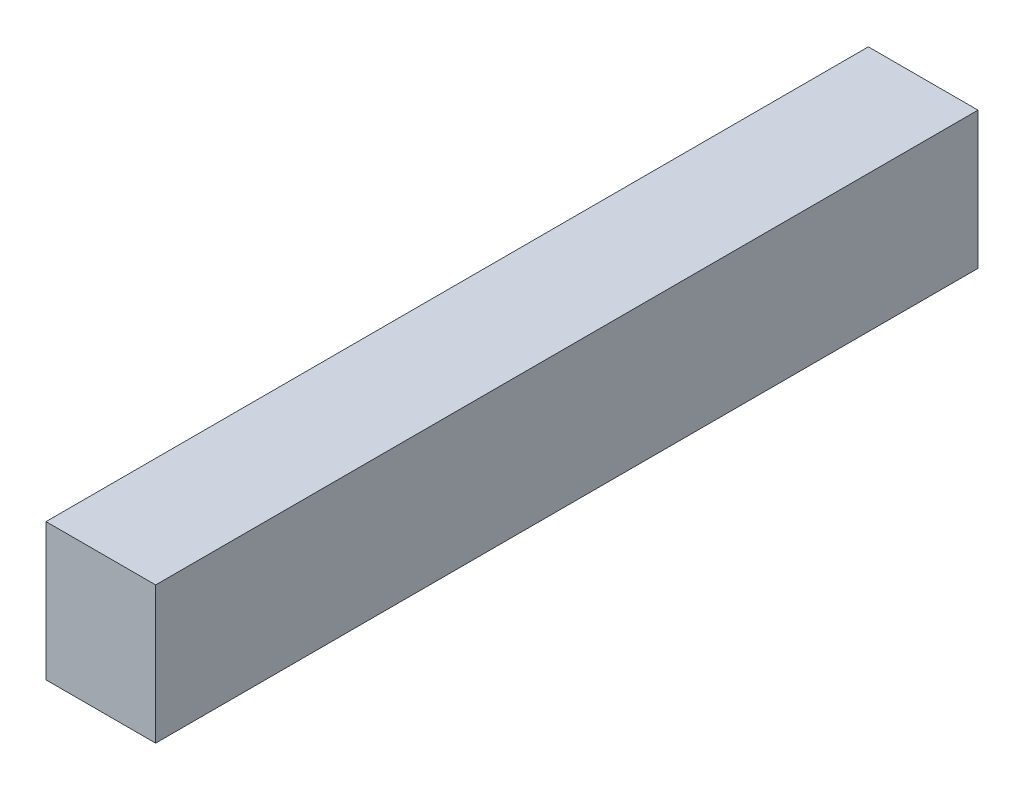
ISO-10303-21;
HEADER;
FILE_DESCRIPTION(('STEP AP214'),'2;1');
FILE_NAME('part.step','',(''),(''),'','','');
FILE_SCHEMA(('AUTOMOTIVE_DESIGN { 1 0 10303 214 1 1 1 1 }'));
ENDSEC;
DATA;
#1=APPLICATION_CONTEXT('core data for automotive mechanical design processes');
#2=APPLICATION_PROTOCOL_DEFINITION('international standard','automotive_design',2000,#1);
#3=PRODUCT_CONTEXT('',#1,'mechanical');
#4=PRODUCT('Part','Part','',(#3));
#5=PRODUCT_RELATED_PRODUCT_CATEGORY('part','',(#4));
#6=PRODUCT_DEFINITION_FORMATION('','',#4);
#7=PRODUCT_DEFINITION_CONTEXT('part definition',#1,'design');
#8=PRODUCT_DEFINITION('design','',#6,#7);
#9=PRODUCT_DEFINITION_SHAPE('','',#8);
#10=(LENGTH_UNIT() NAMED_UNIT(*) SI_UNIT(.MILLI.,.METRE.));
#11=(NAMED_UNIT(*) PLANE_ANGLE_UNIT() SI_UNIT($,.RADIAN.));
#12=(NAMED_UNIT(*) SI_UNIT($,.STERADIAN.) SOLID_ANGLE_UNIT());
#13=UNCERTAINTY_MEASURE_WITH_UNIT(LENGTH_MEASURE(1.E-05),#10,'distance_accuracy_value','');
#14=(GEOMETRIC_REPRESENTATION_CONTEXT(3) GLOBAL_UNCERTAINTY_ASSIGNED_CONTEXT((#13)) GLOBAL_UNIT_ASSIGNED_CONTEXT((#10,
#11,#12)) REPRESENTATION_CONTEXT('',''));
#15=CARTESIAN_POINT('',(0.,0.,0.));
#16=DIRECTION('',(0.,0.,1.));
#17=DIRECTION('',(1.,0.,0.));
#18=AXIS2_PLACEMENT_3D('',#15,#16,#17);
#19=CARTESIAN_POINT('',(0.,0.,30.));
#20=DIRECTION('',(1.,0.,0.));
#21=DIRECTION('',(0.,0.,-1.));
#22=AXIS2_PLACEMENT_3D('',#19,#20,#21);
#23=PLANE('',#22);
#24=DIRECTION('',(0.,-1.,0.));
#25=VECTOR('',#24,1.);
#26=CARTESIAN_POINT('',(0.,0.,0.));
#27=LINE('',#26,#25);
#28=CARTESIAN_POINT('',(0.,5.,0.));
#29=VERTEX_POINT('',#28);
#30=CARTESIAN_POINT('',(0.,0.,0.));
#31=VERTEX_POINT('',#30);
#32=EDGE_CURVE('E97',#29,#31,#27,.T.);
#33=ORIENTED_EDGE('',*,*,#32,.T.);
#34=DIRECTION('',(0.,0.,-1.));
#35=VECTOR('',#34,1.);
#36=CARTESIAN_POINT('',(0.,0.,30.));
#37=LINE('',#36,#35);
#38=CARTESIAN_POINT('',(0.,0.,30.));
#39=VERTEX_POINT('',#38);
#40=EDGE_CURVE('E11',#39,#31,#37,.T.);
#41=ORIENTED_EDGE('',*,*,#40,.F.);
#42=DIRECTION('',(0.,-1.,0.));
#43=VECTOR('',#42,1.);
#44=CARTESIAN_POINT('',(0.,0.,30.));
#45=LINE('',#44,#43);
#46=CARTESIAN_POINT('',(0.,5.,30.));
#47=VERTEX_POINT('',#46);
#48=EDGE_CURVE('E85',#47,#39,#45,.T.);
#49=ORIENTED_EDGE('',*,*,#48,.F.);
#50=DIRECTION('',(0.,0.,-1.));
#51=VECTOR('',#50,1.);
#52=CARTESIAN_POINT('',(0.,5.,30.));
#53=LINE('',#52,#51);
#54=EDGE_CURVE('E93',#47,#29,#53,.T.);
#55=ORIENTED_EDGE('',*,*,#54,.T.);
#56=EDGE_LOOP('',(#33,#41,#49,#55));
#57=FACE_BOUND('',#56,.T.);
#58=ADVANCED_FACE('F34',(#57),#23,.F.);
#59=CARTESIAN_POINT('',(0.,0.,30.));
#60=DIRECTION('',(0.,1.,0.));
#61=DIRECTION('',(0.,0.,1.));
#62=AXIS2_PLACEMENT_3D('',#59,#60,#61);
#63=PLANE('',#62);
#64=DIRECTION('',(1.,0.,0.));
#65=VECTOR('',#64,1.);
#66=CARTESIAN_POINT('',(0.,0.,0.));
#67=LINE('',#66,#65);
#68=CARTESIAN_POINT('',(4.,0.,0.));
#69=VERTEX_POINT('',#68);
#70=EDGE_CURVE('E89',#31,#69,#67,.T.);
#71=ORIENTED_EDGE('',*,*,#70,.T.);
#72=DIRECTION('',(0.,0.,-1.));
#73=VECTOR('',#72,1.);
#74=CARTESIAN_POINT('',(4.,0.,30.));
#75=LINE('',#74,#73);
#76=CARTESIAN_POINT('',(4.,0.,30.));
#77=VERTEX_POINT('',#76);
#78=EDGE_CURVE('E42',#77,#69,#75,.T.);
#79=ORIENTED_EDGE('',*,*,#78,.F.);
#80=DIRECTION('',(1.,0.,0.));
#81=VECTOR('',#80,1.);
#82=CARTESIAN_POINT('',(0.,0.,30.));
#83=LINE('',#82,#81);
#84=EDGE_CURVE('E80',#39,#77,#83,.T.);
#85=ORIENTED_EDGE('',*,*,#84,.F.);
#86=ORIENTED_EDGE('',*,*,#40,.T.);
#87=EDGE_LOOP('',(#71,#79,#85,#86));
#88=FACE_BOUND('',#87,.T.);
#89=ADVANCED_FACE('F88',(#88),#63,.F.);
#90=CARTESIAN_POINT('',(4.,0.,30.));
#91=DIRECTION('',(-1.,0.,0.));
#92=DIRECTION('',(0.,0.,1.));
#93=AXIS2_PLACEMENT_3D('',#90,#91,#92);
#94=PLANE('',#93);
#95=DIRECTION('',(0.,1.,0.));
#96=VECTOR('',#95,1.);
#97=CARTESIAN_POINT('',(4.,0.,0.));
#98=LINE('',#97,#96);
#99=CARTESIAN_POINT('',(4.,5.,0.));
#100=VERTEX_POINT('',#99);
#101=EDGE_CURVE('E67',#69,#100,#98,.T.);
#102=ORIENTED_EDGE('',*,*,#101,.T.);
#103=DIRECTION('',(0.,0.,-1.));
#104=VECTOR('',#103,1.);
#105=CARTESIAN_POINT('',(4.,5.,30.));
#106=LINE('',#105,#104);
#107=CARTESIAN_POINT('',(4.,5.,30.));
#108=VERTEX_POINT('',#107);
#109=EDGE_CURVE('E90',#108,#100,#106,.T.);
#110=ORIENTED_EDGE('',*,*,#109,.F.);
#111=DIRECTION('',(0.,1.,0.));
#112=VECTOR('',#111,1.);
#113=CARTESIAN_POINT('',(4.,0.,30.));
#114=LINE('',#113,#112);
#115=EDGE_CURVE('E83',#77,#108,#114,.T.);
#116=ORIENTED_EDGE('',*,*,#115,.F.);
#117=ORIENTED_EDGE('',*,*,#78,.T.);
#118=EDGE_LOOP('',(#102,#110,#116,#117));
#119=FACE_BOUND('',#118,.T.);
#120=ADVANCED_FACE('F91',(#119),#94,.F.);
#121=CARTESIAN_POINT('',(0.,5.,30.));
#122=DIRECTION('',(0.,-1.,0.));
#123=DIRECTION('',(0.,0.,-1.));
#124=AXIS2_PLACEMENT_3D('',#121,#122,#123);
#125=PLANE('',#124);
#126=DIRECTION('',(-1.,0.,0.));
#127=VECTOR('',#126,1.);
#128=CARTESIAN_POINT('',(0.,5.,0.));
#129=LINE('',#128,#127);
#130=EDGE_CURVE('E73',#100,#29,#129,.T.);
#131=ORIENTED_EDGE('',*,*,#130,.T.);
#132=ORIENTED_EDGE('',*,*,#54,.F.);
#133=DIRECTION('',(-1.,0.,0.));
#134=VECTOR('',#133,1.);
#135=CARTESIAN_POINT('',(0.,5.,30.));
#136=LINE('',#135,#134);
#137=EDGE_CURVE('E50',#108,#47,#136,.T.);
#138=ORIENTED_EDGE('',*,*,#137,.F.);
#139=ORIENTED_EDGE('',*,*,#109,.T.);
#140=EDGE_LOOP('',(#131,#132,#138,#139));
#141=FACE_BOUND('',#140,.T.);
#142=ADVANCED_FACE('F104',(#141),#125,.F.);
#143=CARTESIAN_POINT('',(0.,0.,30.));
#144=DIRECTION('',(0.,0.,-1.));
#145=DIRECTION('',(-1.,0.,0.));
#146=AXIS2_PLACEMENT_3D('',#143,#144,#145);
#147=PLANE('',#146);
#148=ORIENTED_EDGE('',*,*,#48,.T.);
#149=ORIENTED_EDGE('',*,*,#84,.T.);
#150=ORIENTED_EDGE('',*,*,#115,.T.);
#151=ORIENTED_EDGE('',*,*,#137,.T.);
#152=EDGE_LOOP('',(#148,#149,#150,#151));
#153=FACE_BOUND('',#152,.T.);
#154=ADVANCED_FACE('F81',(#153),#147,.F.);
#155=CARTESIAN_POINT('',(0.,0.,0.));
#156=DIRECTION('',(0.,0.,-1.));
#157=DIRECTION('',(-1.,0.,0.));
#158=AXIS2_PLACEMENT_3D('',#155,#156,#157);
#159=PLANE('',#158);
#160=ORIENTED_EDGE('',*,*,#32,.F.);
#161=ORIENTED_EDGE('',*,*,#130,.F.);
#162=ORIENTED_EDGE('',*,*,#101,.F.);
#163=ORIENTED_EDGE('',*,*,#70,.F.);
#164=EDGE_LOOP('',(#160,#161,#162,#163));
#165=FACE_BOUND('',#164,.T.);
#166=ADVANCED_FACE('F107',(#165),#159,.T.);
#167=CLOSED_SHELL('',(#58,#89,#120,#142,#154,#166));
#168=MANIFOLD_SOLID_BREP('B2',#167);
#169=ADVANCED_BREP_SHAPE_REPRESENTATION('',(#18,#168),#14);
#170=SHAPE_DEFINITION_REPRESENTATION(#9,#169);
ENDSEC;
END-ISO-10303-21;
